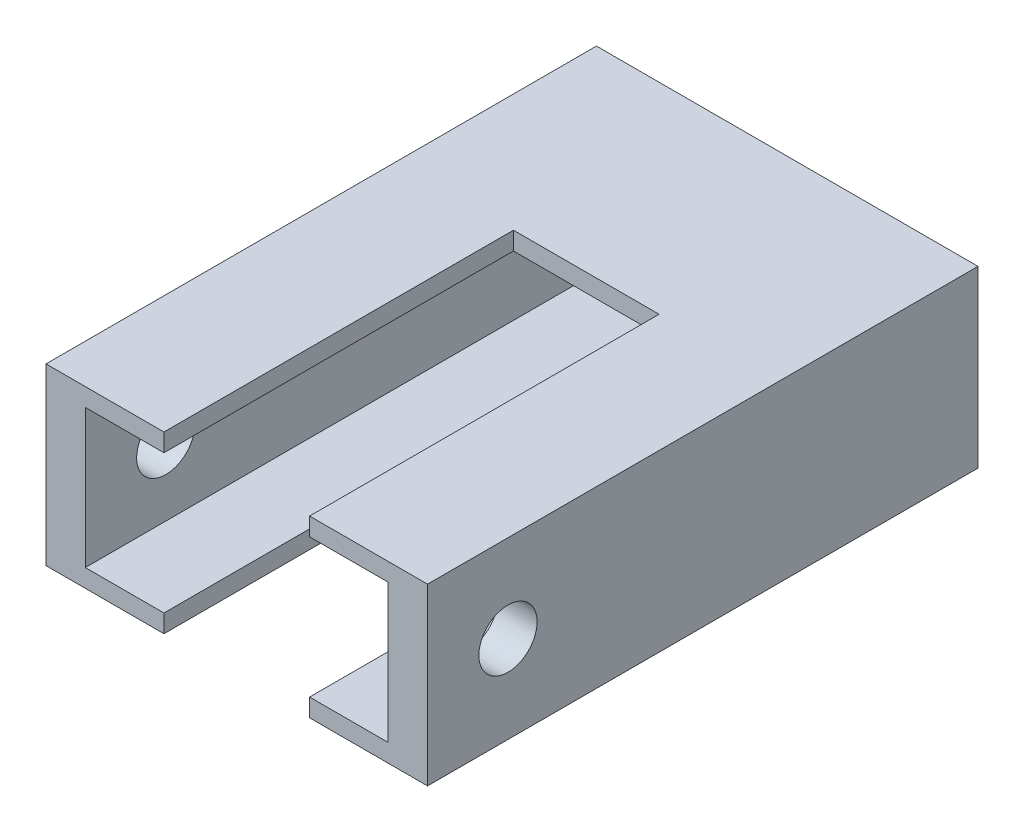
ISO-10303-21;
HEADER;
FILE_DESCRIPTION(('STEP AP214'),'2;1');
FILE_NAME('part.step','',(''),(''),'','','');
FILE_SCHEMA(('AUTOMOTIVE_DESIGN { 1 0 10303 214 1 1 1 1 }'));
ENDSEC;
DATA;
#1=APPLICATION_CONTEXT('core data for automotive mechanical design processes');
#2=APPLICATION_PROTOCOL_DEFINITION('international standard','automotive_design',2000,#1);
#3=PRODUCT_CONTEXT('',#1,'mechanical');
#4=PRODUCT('Part','Part','',(#3));
#5=PRODUCT_RELATED_PRODUCT_CATEGORY('part','',(#4));
#6=PRODUCT_DEFINITION_FORMATION('','',#4);
#7=PRODUCT_DEFINITION_CONTEXT('part definition',#1,'design');
#8=PRODUCT_DEFINITION('design','',#6,#7);
#9=PRODUCT_DEFINITION_SHAPE('','',#8);
#10=(LENGTH_UNIT() NAMED_UNIT(*) SI_UNIT(.MILLI.,.METRE.));
#11=(NAMED_UNIT(*) PLANE_ANGLE_UNIT() SI_UNIT($,.RADIAN.));
#12=(NAMED_UNIT(*) SI_UNIT($,.STERADIAN.) SOLID_ANGLE_UNIT());
#13=UNCERTAINTY_MEASURE_WITH_UNIT(LENGTH_MEASURE(1.E-05),#10,'distance_accuracy_value','');
#14=(GEOMETRIC_REPRESENTATION_CONTEXT(3) GLOBAL_UNCERTAINTY_ASSIGNED_CONTEXT((#13)) GLOBAL_UNIT_ASSIGNED_CONTEXT((#10,
#11,#12)) REPRESENTATION_CONTEXT('',''));
#15=CARTESIAN_POINT('',(0.,0.,0.));
#16=DIRECTION('',(0.,0.,1.));
#17=DIRECTION('',(1.,0.,0.));
#18=AXIS2_PLACEMENT_3D('',#15,#16,#17);
#19=CARTESIAN_POINT('',(0.,0.,94.5));
#20=DIRECTION('',(0.,0.,-1.));
#21=DIRECTION('',(-1.,0.,0.));
#22=AXIS2_PLACEMENT_3D('',#19,#20,#21);
#23=PLANE('',#22);
#24=DIRECTION('',(1.,0.,0.));
#25=VECTOR('',#24,1.);
#26=CARTESIAN_POINT('',(-32.75,15.,94.5));
#27=LINE('',#26,#25);
#28=CARTESIAN_POINT('',(12.5,15.,94.5));
#29=VERTEX_POINT('',#28);
#30=CARTESIAN_POINT('',(32.75,15.,94.5));
#31=VERTEX_POINT('',#30);
#32=EDGE_CURVE('E297',#29,#31,#27,.T.);
#33=ORIENTED_EDGE('',*,*,#32,.F.);
#34=DIRECTION('',(0.,1.,0.));
#35=VECTOR('',#34,1.);
#36=CARTESIAN_POINT('',(12.5,15.,94.5));
#37=LINE('',#36,#35);
#38=CARTESIAN_POINT('',(12.5,11.9083969465649,94.5));
#39=VERTEX_POINT('',#38);
#40=EDGE_CURVE('E371',#39,#29,#37,.T.);
#41=ORIENTED_EDGE('',*,*,#40,.F.);
#42=DIRECTION('',(1.,0.,0.));
#43=VECTOR('',#42,1.);
#44=CARTESIAN_POINT('',(-26.,11.9083969465649,94.5));
#45=LINE('',#44,#43);
#46=CARTESIAN_POINT('',(26.,11.9083969465649,94.5));
#47=VERTEX_POINT('',#46);
#48=EDGE_CURVE('E263',#39,#47,#45,.T.);
#49=ORIENTED_EDGE('',*,*,#48,.T.);
#50=DIRECTION('',(0.,-1.,0.));
#51=VECTOR('',#50,1.);
#52=CARTESIAN_POINT('',(26.,11.9083969465649,94.5));
#53=LINE('',#52,#51);
#54=CARTESIAN_POINT('',(26.,-11.9083969465649,94.5));
#55=VERTEX_POINT('',#54);
#56=EDGE_CURVE('E259',#47,#55,#53,.T.);
#57=ORIENTED_EDGE('',*,*,#56,.T.);
#58=DIRECTION('',(1.,0.,0.));
#59=VECTOR('',#58,1.);
#60=CARTESIAN_POINT('',(-26.,-11.9083969465649,94.5));
#61=LINE('',#60,#59);
#62=CARTESIAN_POINT('',(12.5,-11.9083969465649,94.5));
#63=VERTEX_POINT('',#62);
#64=EDGE_CURVE('E254',#63,#55,#61,.T.);
#65=ORIENTED_EDGE('',*,*,#64,.F.);
#66=CARTESIAN_POINT('',(12.5,-15.,94.5));
#67=VERTEX_POINT('',#66);
#68=EDGE_CURVE('E357',#67,#63,#37,.T.);
#69=ORIENTED_EDGE('',*,*,#68,.F.);
#70=DIRECTION('',(1.,0.,0.));
#71=VECTOR('',#70,1.);
#72=CARTESIAN_POINT('',(-32.75,-15.,94.5));
#73=LINE('',#72,#71);
#74=CARTESIAN_POINT('',(32.75,-15.,94.5));
#75=VERTEX_POINT('',#74);
#76=EDGE_CURVE('E293',#67,#75,#73,.T.);
#77=ORIENTED_EDGE('',*,*,#76,.T.);
#78=DIRECTION('',(0.,-1.,0.));
#79=VECTOR('',#78,1.);
#80=CARTESIAN_POINT('',(32.75,15.,94.5));
#81=LINE('',#80,#79);
#82=EDGE_CURVE('E292',#31,#75,#81,.T.);
#83=ORIENTED_EDGE('',*,*,#82,.F.);
#84=EDGE_LOOP('',(#33,#41,#49,#57,#65,#69,#77,#83));
#85=FACE_BOUND('',#84,.T.);
#86=ADVANCED_FACE('F69',(#85),#23,.F.);
#87=CARTESIAN_POINT('',(-26.,-11.9083969465649,94.5));
#88=DIRECTION('',(0.,1.,0.));
#89=DIRECTION('',(0.,0.,1.));
#90=AXIS2_PLACEMENT_3D('',#87,#88,#89);
#91=PLANE('',#90);
#92=DIRECTION('',(0.,0.,-1.));
#93=VECTOR('',#92,1.);
#94=CARTESIAN_POINT('',(12.5,-11.9083969465649,94.5));
#95=LINE('',#94,#93);
#96=CARTESIAN_POINT('',(12.5,-11.9083969465649,34.5));
#97=VERTEX_POINT('',#96);
#98=EDGE_CURVE('E235',#63,#97,#95,.T.);
#99=ORIENTED_EDGE('',*,*,#98,.F.);
#100=ORIENTED_EDGE('',*,*,#64,.T.);
#101=DIRECTION('',(0.,0.,-1.));
#102=VECTOR('',#101,1.);
#103=CARTESIAN_POINT('',(26.,-11.9083969465649,94.5));
#104=LINE('',#103,#102);
#105=CARTESIAN_POINT('',(26.,-11.9083969465649,10.));
#106=VERTEX_POINT('',#105);
#107=EDGE_CURVE('E283',#55,#106,#104,.T.);
#108=ORIENTED_EDGE('',*,*,#107,.T.);
#109=DIRECTION('',(-1.,0.,0.));
#110=VECTOR('',#109,1.);
#111=CARTESIAN_POINT('',(26.,-11.9083969465649,10.));
#112=LINE('',#111,#110);
#113=CARTESIAN_POINT('',(-26.,-11.9083969465649,10.));
#114=VERTEX_POINT('',#113);
#115=EDGE_CURVE('E250',#106,#114,#112,.T.);
#116=ORIENTED_EDGE('',*,*,#115,.T.);
#117=DIRECTION('',(0.,0.,-1.));
#118=VECTOR('',#117,1.);
#119=CARTESIAN_POINT('',(-26.,-11.9083969465649,94.5));
#120=LINE('',#119,#118);
#121=CARTESIAN_POINT('',(-26.,-11.9083969465649,94.5));
#122=VERTEX_POINT('',#121);
#123=EDGE_CURVE('E271',#122,#114,#120,.T.);
#124=ORIENTED_EDGE('',*,*,#123,.F.);
#125=CARTESIAN_POINT('',(-12.5,-11.9083969465649,94.5));
#126=VERTEX_POINT('',#125);
#127=EDGE_CURVE('E255',#122,#126,#61,.T.);
#128=ORIENTED_EDGE('',*,*,#127,.T.);
#129=DIRECTION('',(0.,0.,1.));
#130=VECTOR('',#129,1.);
#131=CARTESIAN_POINT('',(-12.5,-11.9083969465649,94.5));
#132=LINE('',#131,#130);
#133=CARTESIAN_POINT('',(-12.5,-11.9083969465649,34.5));
#134=VERTEX_POINT('',#133);
#135=EDGE_CURVE('E228',#134,#126,#132,.T.);
#136=ORIENTED_EDGE('',*,*,#135,.F.);
#137=DIRECTION('',(1.,0.,0.));
#138=VECTOR('',#137,1.);
#139=CARTESIAN_POINT('',(-26.,-11.9083969465649,34.5));
#140=LINE('',#139,#138);
#141=EDGE_CURVE('E222',#134,#97,#140,.T.);
#142=ORIENTED_EDGE('',*,*,#141,.T.);
#143=EDGE_LOOP('',(#99,#100,#108,#116,#124,#128,#136,#142));
#144=FACE_BOUND('',#143,.T.);
#145=ADVANCED_FACE('F377',(#144),#91,.T.);
#146=CARTESIAN_POINT('',(26.,11.9083969465649,94.5));
#147=DIRECTION('',(1.,0.,0.));
#148=DIRECTION('',(0.,0.,-1.));
#149=AXIS2_PLACEMENT_3D('',#146,#147,#148);
#150=PLANE('',#149);
#151=CARTESIAN_POINT('',(26.,0.,80.6908236263912));
#152=DIRECTION('',(1.,0.,0.));
#153=DIRECTION('',(0.,0.,-1.));
#154=AXIS2_PLACEMENT_3D('',#151,#152,#153);
#155=CIRCLE('',#154,5.);
#156=CARTESIAN_POINT('',(26.,0.,75.6908236263912));
#157=VERTEX_POINT('',#156);
#158=EDGE_CURVE('E400',#157,#157,#155,.T.);
#159=ORIENTED_EDGE('',*,*,#158,.T.);
#160=EDGE_LOOP('',(#159));
#161=FACE_BOUND('',#160,.T.);
#162=DIRECTION('',(0.,-1.,0.));
#163=VECTOR('',#162,1.);
#164=CARTESIAN_POINT('',(26.,11.9083969465649,10.));
#165=LINE('',#164,#163);
#166=CARTESIAN_POINT('',(26.,11.9083969465649,10.));
#167=VERTEX_POINT('',#166);
#168=EDGE_CURVE('E246',#167,#106,#165,.T.);
#169=ORIENTED_EDGE('',*,*,#168,.T.);
#170=ORIENTED_EDGE('',*,*,#107,.F.);
#171=ORIENTED_EDGE('',*,*,#56,.F.);
#172=DIRECTION('',(0.,0.,-1.));
#173=VECTOR('',#172,1.);
#174=CARTESIAN_POINT('',(26.,11.9083969465649,94.5));
#175=LINE('',#174,#173);
#176=EDGE_CURVE('E279',#47,#167,#175,.T.);
#177=ORIENTED_EDGE('',*,*,#176,.T.);
#178=EDGE_LOOP('',(#169,#170,#171,#177));
#179=FACE_BOUND('',#178,.T.);
#180=ADVANCED_FACE('F380',(#161,#179),#150,.F.);
#181=CARTESIAN_POINT('',(-26.,11.9083969465649,94.5));
#182=DIRECTION('',(0.,1.,0.));
#183=DIRECTION('',(0.,0.,1.));
#184=AXIS2_PLACEMENT_3D('',#181,#182,#183);
#185=PLANE('',#184);
#186=ORIENTED_EDGE('',*,*,#48,.F.);
#187=DIRECTION('',(0.,0.,-1.));
#188=VECTOR('',#187,1.);
#189=CARTESIAN_POINT('',(12.5,11.9083969465649,94.5));
#190=LINE('',#189,#188);
#191=CARTESIAN_POINT('',(12.5,11.9083969465649,34.5));
#192=VERTEX_POINT('',#191);
#193=EDGE_CURVE('E231',#39,#192,#190,.T.);
#194=ORIENTED_EDGE('',*,*,#193,.T.);
#195=DIRECTION('',(1.,0.,0.));
#196=VECTOR('',#195,1.);
#197=CARTESIAN_POINT('',(-26.,11.9083969465649,34.5));
#198=LINE('',#197,#196);
#199=CARTESIAN_POINT('',(-12.5,11.9083969465649,34.5));
#200=VERTEX_POINT('',#199);
#201=EDGE_CURVE('E219',#200,#192,#198,.T.);
#202=ORIENTED_EDGE('',*,*,#201,.F.);
#203=DIRECTION('',(0.,0.,1.));
#204=VECTOR('',#203,1.);
#205=CARTESIAN_POINT('',(-12.5,11.9083969465649,94.5));
#206=LINE('',#205,#204);
#207=CARTESIAN_POINT('',(-12.5,11.9083969465649,94.5));
#208=VERTEX_POINT('',#207);
#209=EDGE_CURVE('E191',#200,#208,#206,.T.);
#210=ORIENTED_EDGE('',*,*,#209,.T.);
#211=CARTESIAN_POINT('',(-26.,11.9083969465649,94.5));
#212=VERTEX_POINT('',#211);
#213=EDGE_CURVE('E264',#212,#208,#45,.T.);
#214=ORIENTED_EDGE('',*,*,#213,.F.);
#215=DIRECTION('',(0.,0.,-1.));
#216=VECTOR('',#215,1.);
#217=CARTESIAN_POINT('',(-26.,11.9083969465649,94.5));
#218=LINE('',#217,#216);
#219=CARTESIAN_POINT('',(-26.,11.9083969465649,9.99999999999999));
#220=VERTEX_POINT('',#219);
#221=EDGE_CURVE('E275',#212,#220,#218,.T.);
#222=ORIENTED_EDGE('',*,*,#221,.T.);
#223=DIRECTION('',(1.,0.,0.));
#224=VECTOR('',#223,1.);
#225=CARTESIAN_POINT('',(26.,11.9083969465649,10.));
#226=LINE('',#225,#224);
#227=EDGE_CURVE('E242',#220,#167,#226,.T.);
#228=ORIENTED_EDGE('',*,*,#227,.T.);
#229=ORIENTED_EDGE('',*,*,#176,.F.);
#230=EDGE_LOOP('',(#186,#194,#202,#210,#214,#222,#228,#229));
#231=FACE_BOUND('',#230,.T.);
#232=ADVANCED_FACE('F385',(#231),#185,.F.);
#233=CARTESIAN_POINT('',(-26.,11.9083969465649,94.5));
#234=DIRECTION('',(1.,0.,0.));
#235=DIRECTION('',(0.,0.,-1.));
#236=AXIS2_PLACEMENT_3D('',#233,#234,#235);
#237=PLANE('',#236);
#238=CARTESIAN_POINT('',(-26.,0.,80.6908236263912));
#239=DIRECTION('',(1.,0.,0.));
#240=DIRECTION('',(0.,0.,-1.));
#241=AXIS2_PLACEMENT_3D('',#238,#239,#240);
#242=CIRCLE('',#241,5.);
#243=CARTESIAN_POINT('',(-26.,0.,75.6908236263912));
#244=VERTEX_POINT('',#243);
#245=EDGE_CURVE('E404',#244,#244,#242,.T.);
#246=ORIENTED_EDGE('',*,*,#245,.F.);
#247=EDGE_LOOP('',(#246));
#248=FACE_BOUND('',#247,.T.);
#249=ORIENTED_EDGE('',*,*,#123,.T.);
#250=DIRECTION('',(0.,1.,0.));
#251=VECTOR('',#250,1.);
#252=CARTESIAN_POINT('',(-26.,11.9083969465649,10.));
#253=LINE('',#252,#251);
#254=EDGE_CURVE('E238',#114,#220,#253,.T.);
#255=ORIENTED_EDGE('',*,*,#254,.T.);
#256=ORIENTED_EDGE('',*,*,#221,.F.);
#257=DIRECTION('',(0.,-1.,0.));
#258=VECTOR('',#257,1.);
#259=CARTESIAN_POINT('',(-26.,11.9083969465649,94.5));
#260=LINE('',#259,#258);
#261=EDGE_CURVE('E268',#212,#122,#260,.T.);
#262=ORIENTED_EDGE('',*,*,#261,.T.);
#263=EDGE_LOOP('',(#249,#255,#256,#262));
#264=FACE_BOUND('',#263,.T.);
#265=ADVANCED_FACE('F390',(#248,#264),#237,.T.);
#266=CARTESIAN_POINT('',(-32.75,-15.,94.5));
#267=VERTEX_POINT('',#266);
#268=CARTESIAN_POINT('',(-12.5,-15.,94.5));
#269=VERTEX_POINT('',#268);
#270=EDGE_CURVE('E288',#267,#269,#73,.T.);
#271=ORIENTED_EDGE('',*,*,#270,.T.);
#272=DIRECTION('',(0.,-1.,0.));
#273=VECTOR('',#272,1.);
#274=CARTESIAN_POINT('',(-12.5,15.,94.5));
#275=LINE('',#274,#273);
#276=EDGE_CURVE('E349',#126,#269,#275,.T.);
#277=ORIENTED_EDGE('',*,*,#276,.F.);
#278=ORIENTED_EDGE('',*,*,#127,.F.);
#279=ORIENTED_EDGE('',*,*,#261,.F.);
#280=ORIENTED_EDGE('',*,*,#213,.T.);
#281=CARTESIAN_POINT('',(-12.5,15.,94.5));
#282=VERTEX_POINT('',#281);
#283=EDGE_CURVE('E350',#282,#208,#275,.T.);
#284=ORIENTED_EDGE('',*,*,#283,.F.);
#285=CARTESIAN_POINT('',(-32.75,15.,94.5));
#286=VERTEX_POINT('',#285);
#287=EDGE_CURVE('E209',#286,#282,#27,.T.);
#288=ORIENTED_EDGE('',*,*,#287,.F.);
#289=DIRECTION('',(0.,-1.,0.));
#290=VECTOR('',#289,1.);
#291=CARTESIAN_POINT('',(-32.75,15.,94.5));
#292=LINE('',#291,#290);
#293=EDGE_CURVE('E300',#286,#267,#292,.T.);
#294=ORIENTED_EDGE('',*,*,#293,.T.);
#295=EDGE_LOOP('',(#271,#277,#278,#279,#280,#284,#288,#294));
#296=FACE_BOUND('',#295,.T.);
#297=ADVANCED_FACE('F347',(#296),#23,.F.);
#298=CARTESIAN_POINT('',(0.,0.,0.));
#299=DIRECTION('',(0.,0.,-1.));
#300=DIRECTION('',(-1.,0.,0.));
#301=AXIS2_PLACEMENT_3D('',#298,#299,#300);
#302=PLANE('',#301);
#303=CARTESIAN_POINT('',(0.,0.,0.));
#304=DIRECTION('',(0.,0.,-1.));
#305=DIRECTION('',(-1.,0.,0.));
#306=AXIS2_PLACEMENT_3D('',#303,#304,#305);
#307=CIRCLE('',#306,5.);
#308=CARTESIAN_POINT('',(-5.,0.,0.));
#309=VERTEX_POINT('',#308);
#310=EDGE_CURVE('E416',#309,#309,#307,.T.);
#311=ORIENTED_EDGE('',*,*,#310,.F.);
#312=EDGE_LOOP('',(#311));
#313=FACE_BOUND('',#312,.T.);
#314=DIRECTION('',(1.,0.,0.));
#315=VECTOR('',#314,1.);
#316=CARTESIAN_POINT('',(-32.75,-15.,0.));
#317=LINE('',#316,#315);
#318=CARTESIAN_POINT('',(-32.75,-15.,0.));
#319=VERTEX_POINT('',#318);
#320=CARTESIAN_POINT('',(32.75,-15.,0.));
#321=VERTEX_POINT('',#320);
#322=EDGE_CURVE('E287',#319,#321,#317,.T.);
#323=ORIENTED_EDGE('',*,*,#322,.F.);
#324=DIRECTION('',(0.,-1.,0.));
#325=VECTOR('',#324,1.);
#326=CARTESIAN_POINT('',(-32.75,15.,0.));
#327=LINE('',#326,#325);
#328=CARTESIAN_POINT('',(-32.75,15.,0.));
#329=VERTEX_POINT('',#328);
#330=EDGE_CURVE('E315',#329,#319,#327,.T.);
#331=ORIENTED_EDGE('',*,*,#330,.F.);
#332=DIRECTION('',(1.,0.,0.));
#333=VECTOR('',#332,1.);
#334=CARTESIAN_POINT('',(-32.75,15.,0.));
#335=LINE('',#334,#333);
#336=CARTESIAN_POINT('',(32.75,15.,0.));
#337=VERTEX_POINT('',#336);
#338=EDGE_CURVE('E311',#329,#337,#335,.T.);
#339=ORIENTED_EDGE('',*,*,#338,.T.);
#340=DIRECTION('',(0.,-1.,0.));
#341=VECTOR('',#340,1.);
#342=CARTESIAN_POINT('',(32.75,15.,0.));
#343=LINE('',#342,#341);
#344=EDGE_CURVE('E307',#337,#321,#343,.T.);
#345=ORIENTED_EDGE('',*,*,#344,.T.);
#346=EDGE_LOOP('',(#323,#331,#339,#345));
#347=FACE_BOUND('',#346,.T.);
#348=ADVANCED_FACE('F336',(#313,#347),#302,.T.);
#349=CARTESIAN_POINT('',(-32.75,-15.,94.5));
#350=DIRECTION('',(0.,1.,0.));
#351=DIRECTION('',(0.,0.,1.));
#352=AXIS2_PLACEMENT_3D('',#349,#350,#351);
#353=PLANE('',#352);
#354=ORIENTED_EDGE('',*,*,#76,.F.);
#355=DIRECTION('',(0.,0.,1.));
#356=VECTOR('',#355,1.);
#357=CARTESIAN_POINT('',(12.5,-15.,34.5));
#358=LINE('',#357,#356);
#359=CARTESIAN_POINT('',(12.5,-15.,34.5));
#360=VERTEX_POINT('',#359);
#361=EDGE_CURVE('E214',#360,#67,#358,.T.);
#362=ORIENTED_EDGE('',*,*,#361,.F.);
#363=DIRECTION('',(1.,0.,0.));
#364=VECTOR('',#363,1.);
#365=CARTESIAN_POINT('',(-12.5,-15.,34.5));
#366=LINE('',#365,#364);
#367=CARTESIAN_POINT('',(-12.5,-15.,34.5));
#368=VERTEX_POINT('',#367);
#369=EDGE_CURVE('E195',#368,#360,#366,.T.);
#370=ORIENTED_EDGE('',*,*,#369,.F.);
#371=DIRECTION('',(0.,0.,1.));
#372=VECTOR('',#371,1.);
#373=CARTESIAN_POINT('',(-12.5,-15.,34.5));
#374=LINE('',#373,#372);
#375=EDGE_CURVE('E86',#368,#269,#374,.T.);
#376=ORIENTED_EDGE('',*,*,#375,.T.);
#377=ORIENTED_EDGE('',*,*,#270,.F.);
#378=DIRECTION('',(0.,0.,-1.));
#379=VECTOR('',#378,1.);
#380=CARTESIAN_POINT('',(-32.75,-15.,94.5));
#381=LINE('',#380,#379);
#382=EDGE_CURVE('E303',#267,#319,#381,.T.);
#383=ORIENTED_EDGE('',*,*,#382,.T.);
#384=ORIENTED_EDGE('',*,*,#322,.T.);
#385=DIRECTION('',(0.,0.,-1.));
#386=VECTOR('',#385,1.);
#387=CARTESIAN_POINT('',(32.75,-15.,94.5));
#388=LINE('',#387,#386);
#389=EDGE_CURVE('E12',#75,#321,#388,.T.);
#390=ORIENTED_EDGE('',*,*,#389,.F.);
#391=EDGE_LOOP('',(#354,#362,#370,#376,#377,#383,#384,#390));
#392=FACE_BOUND('',#391,.T.);
#393=ADVANCED_FACE('F71',(#392),#353,.F.);
#394=CARTESIAN_POINT('',(32.75,15.,94.5));
#395=DIRECTION('',(1.,0.,0.));
#396=DIRECTION('',(0.,1.,0.));
#397=AXIS2_PLACEMENT_3D('',#394,#395,#396);
#398=PLANE('',#397);
#399=CARTESIAN_POINT('',(32.75,0.,80.6908236263912));
#400=DIRECTION('',(-1.,0.,0.));
#401=DIRECTION('',(0.,-1.,0.));
#402=AXIS2_PLACEMENT_3D('',#399,#400,#401);
#403=CIRCLE('',#402,5.);
#404=CARTESIAN_POINT('',(32.75,-4.99999999999999,80.6908236263912));
#405=VERTEX_POINT('',#404);
#406=EDGE_CURVE('E408',#405,#405,#403,.T.);
#407=ORIENTED_EDGE('',*,*,#406,.T.);
#408=EDGE_LOOP('',(#407));
#409=FACE_BOUND('',#408,.T.);
#410=ORIENTED_EDGE('',*,*,#344,.F.);
#411=DIRECTION('',(0.,0.,-1.));
#412=VECTOR('',#411,1.);
#413=CARTESIAN_POINT('',(32.75,15.,94.5));
#414=LINE('',#413,#412);
#415=EDGE_CURVE('E79',#31,#337,#414,.T.);
#416=ORIENTED_EDGE('',*,*,#415,.F.);
#417=ORIENTED_EDGE('',*,*,#82,.T.);
#418=ORIENTED_EDGE('',*,*,#389,.T.);
#419=EDGE_LOOP('',(#410,#416,#417,#418));
#420=FACE_BOUND('',#419,.T.);
#421=ADVANCED_FACE('F331',(#409,#420),#398,.T.);
#422=CARTESIAN_POINT('',(-32.75,15.,94.5));
#423=DIRECTION('',(0.,1.,0.));
#424=DIRECTION('',(0.,0.,1.));
#425=AXIS2_PLACEMENT_3D('',#422,#423,#424);
#426=PLANE('',#425);
#427=DIRECTION('',(0.,0.,1.));
#428=VECTOR('',#427,1.);
#429=CARTESIAN_POINT('',(12.5,15.,34.5));
#430=LINE('',#429,#428);
#431=CARTESIAN_POINT('',(12.5,15.,34.5));
#432=VERTEX_POINT('',#431);
#433=EDGE_CURVE('E94',#432,#29,#430,.T.);
#434=ORIENTED_EDGE('',*,*,#433,.T.);
#435=ORIENTED_EDGE('',*,*,#32,.T.);
#436=ORIENTED_EDGE('',*,*,#415,.T.);
#437=ORIENTED_EDGE('',*,*,#338,.F.);
#438=DIRECTION('',(0.,0.,-1.));
#439=VECTOR('',#438,1.);
#440=CARTESIAN_POINT('',(-32.75,15.,94.5));
#441=LINE('',#440,#439);
#442=EDGE_CURVE('E321',#286,#329,#441,.T.);
#443=ORIENTED_EDGE('',*,*,#442,.F.);
#444=ORIENTED_EDGE('',*,*,#287,.T.);
#445=DIRECTION('',(0.,0.,1.));
#446=VECTOR('',#445,1.);
#447=CARTESIAN_POINT('',(-12.5,15.,34.5));
#448=LINE('',#447,#446);
#449=CARTESIAN_POINT('',(-12.5,15.,34.5));
#450=VERTEX_POINT('',#449);
#451=EDGE_CURVE('E188',#450,#282,#448,.T.);
#452=ORIENTED_EDGE('',*,*,#451,.F.);
#453=DIRECTION('',(-1.,0.,0.));
#454=VECTOR('',#453,1.);
#455=CARTESIAN_POINT('',(-12.5,15.,34.5));
#456=LINE('',#455,#454);
#457=EDGE_CURVE('E199',#432,#450,#456,.T.);
#458=ORIENTED_EDGE('',*,*,#457,.F.);
#459=EDGE_LOOP('',(#434,#435,#436,#437,#443,#444,#452,#458));
#460=FACE_BOUND('',#459,.T.);
#461=ADVANCED_FACE('F207',(#460),#426,.T.);
#462=CARTESIAN_POINT('',(-32.75,15.,94.5));
#463=DIRECTION('',(1.,0.,0.));
#464=DIRECTION('',(0.,1.,0.));
#465=AXIS2_PLACEMENT_3D('',#462,#463,#464);
#466=PLANE('',#465);
#467=CARTESIAN_POINT('',(-32.75,0.,80.6908236263912));
#468=DIRECTION('',(-1.,0.,0.));
#469=DIRECTION('',(0.,-1.,0.));
#470=AXIS2_PLACEMENT_3D('',#467,#468,#469);
#471=CIRCLE('',#470,5.);
#472=CARTESIAN_POINT('',(-32.75,-5.00000000000002,80.6908236263912));
#473=VERTEX_POINT('',#472);
#474=EDGE_CURVE('E409',#473,#473,#471,.T.);
#475=ORIENTED_EDGE('',*,*,#474,.F.);
#476=EDGE_LOOP('',(#475));
#477=FACE_BOUND('',#476,.T.);
#478=ORIENTED_EDGE('',*,*,#330,.T.);
#479=ORIENTED_EDGE('',*,*,#382,.F.);
#480=ORIENTED_EDGE('',*,*,#293,.F.);
#481=ORIENTED_EDGE('',*,*,#442,.T.);
#482=EDGE_LOOP('',(#478,#479,#480,#481));
#483=FACE_BOUND('',#482,.T.);
#484=ADVANCED_FACE('F339',(#477,#483),#466,.F.);
#485=CARTESIAN_POINT('',(0.,0.,10.));
#486=DIRECTION('',(0.,0.,-1.));
#487=DIRECTION('',(-1.,0.,0.));
#488=AXIS2_PLACEMENT_3D('',#485,#486,#487);
#489=PLANE('',#488);
#490=CARTESIAN_POINT('',(0.,0.,9.99999999999999));
#491=DIRECTION('',(0.,0.,-1.));
#492=DIRECTION('',(-1.,0.,0.));
#493=AXIS2_PLACEMENT_3D('',#490,#491,#492);
#494=CIRCLE('',#493,5.);
#495=CARTESIAN_POINT('',(-5.,0.,9.99999999999999));
#496=VERTEX_POINT('',#495);
#497=EDGE_CURVE('E73',#496,#496,#494,.T.);
#498=ORIENTED_EDGE('',*,*,#497,.T.);
#499=EDGE_LOOP('',(#498));
#500=FACE_BOUND('',#499,.T.);
#501=ORIENTED_EDGE('',*,*,#254,.F.);
#502=ORIENTED_EDGE('',*,*,#115,.F.);
#503=ORIENTED_EDGE('',*,*,#168,.F.);
#504=ORIENTED_EDGE('',*,*,#227,.F.);
#505=EDGE_LOOP('',(#501,#502,#503,#504));
#506=FACE_BOUND('',#505,.T.);
#507=ADVANCED_FACE('F388',(#500,#506),#489,.F.);
#508=CARTESIAN_POINT('',(0.,0.,34.5));
#509=DIRECTION('',(0.,0.,1.));
#510=DIRECTION('',(1.,0.,0.));
#511=AXIS2_PLACEMENT_3D('',#508,#509,#510);
#512=PLANE('',#511);
#513=ORIENTED_EDGE('',*,*,#201,.T.);
#514=DIRECTION('',(0.,1.,0.));
#515=VECTOR('',#514,1.);
#516=CARTESIAN_POINT('',(12.5,15.,34.5));
#517=LINE('',#516,#515);
#518=EDGE_CURVE('E201',#192,#432,#517,.T.);
#519=ORIENTED_EDGE('',*,*,#518,.T.);
#520=ORIENTED_EDGE('',*,*,#457,.T.);
#521=DIRECTION('',(0.,-1.,0.));
#522=VECTOR('',#521,1.);
#523=CARTESIAN_POINT('',(-12.5,15.,34.5));
#524=LINE('',#523,#522);
#525=EDGE_CURVE('E184',#450,#200,#524,.T.);
#526=ORIENTED_EDGE('',*,*,#525,.T.);
#527=EDGE_LOOP('',(#513,#519,#520,#526));
#528=FACE_BOUND('',#527,.T.);
#529=ADVANCED_FACE('F200',(#528),#512,.T.);
#530=CARTESIAN_POINT('',(-12.5,15.,34.5));
#531=DIRECTION('',(-1.,0.,0.));
#532=DIRECTION('',(0.,0.,1.));
#533=AXIS2_PLACEMENT_3D('',#530,#531,#532);
#534=PLANE('',#533);
#535=ORIENTED_EDGE('',*,*,#525,.F.);
#536=ORIENTED_EDGE('',*,*,#451,.T.);
#537=ORIENTED_EDGE('',*,*,#283,.T.);
#538=ORIENTED_EDGE('',*,*,#209,.F.);
#539=EDGE_LOOP('',(#535,#536,#537,#538));
#540=FACE_BOUND('',#539,.T.);
#541=ADVANCED_FACE('F186',(#540),#534,.F.);
#542=CARTESIAN_POINT('',(12.5,15.,34.5));
#543=DIRECTION('',(1.,0.,0.));
#544=DIRECTION('',(0.,1.,0.));
#545=AXIS2_PLACEMENT_3D('',#542,#543,#544);
#546=PLANE('',#545);
#547=ORIENTED_EDGE('',*,*,#40,.T.);
#548=ORIENTED_EDGE('',*,*,#433,.F.);
#549=ORIENTED_EDGE('',*,*,#518,.F.);
#550=ORIENTED_EDGE('',*,*,#193,.F.);
#551=EDGE_LOOP('',(#547,#548,#549,#550));
#552=FACE_BOUND('',#551,.T.);
#553=ADVANCED_FACE('F491',(#552),#546,.F.);
#554=ORIENTED_EDGE('',*,*,#98,.T.);
#555=EDGE_CURVE('E204',#360,#97,#517,.T.);
#556=ORIENTED_EDGE('',*,*,#555,.F.);
#557=ORIENTED_EDGE('',*,*,#361,.T.);
#558=ORIENTED_EDGE('',*,*,#68,.T.);
#559=EDGE_LOOP('',(#554,#556,#557,#558));
#560=FACE_BOUND('',#559,.T.);
#561=ADVANCED_FACE('F364',(#560),#546,.F.);
#562=ORIENTED_EDGE('',*,*,#135,.T.);
#563=ORIENTED_EDGE('',*,*,#276,.T.);
#564=ORIENTED_EDGE('',*,*,#375,.F.);
#565=EDGE_CURVE('E196',#134,#368,#524,.T.);
#566=ORIENTED_EDGE('',*,*,#565,.F.);
#567=EDGE_LOOP('',(#562,#563,#564,#566));
#568=FACE_BOUND('',#567,.T.);
#569=ADVANCED_FACE('F393',(#568),#534,.F.);
#570=ORIENTED_EDGE('',*,*,#565,.T.);
#571=ORIENTED_EDGE('',*,*,#369,.T.);
#572=ORIENTED_EDGE('',*,*,#555,.T.);
#573=ORIENTED_EDGE('',*,*,#141,.F.);
#574=EDGE_LOOP('',(#570,#571,#572,#573));
#575=FACE_BOUND('',#574,.T.);
#576=ADVANCED_FACE('F397',(#575),#512,.T.);
#577=CARTESIAN_POINT('',(32.75,0.,80.6908236263912));
#578=DIRECTION('',(-1.,0.,0.));
#579=DIRECTION('',(0.,-1.,0.));
#580=AXIS2_PLACEMENT_3D('',#577,#578,#579);
#581=CYLINDRICAL_SURFACE('',#580,5.);
#582=ORIENTED_EDGE('',*,*,#245,.T.);
#583=EDGE_LOOP('',(#582));
#584=FACE_BOUND('',#583,.T.);
#585=ORIENTED_EDGE('',*,*,#474,.T.);
#586=EDGE_LOOP('',(#585));
#587=FACE_BOUND('',#586,.T.);
#588=ADVANCED_FACE('F434',(#584,#587),#581,.F.);
#589=ORIENTED_EDGE('',*,*,#406,.F.);
#590=EDGE_LOOP('',(#589));
#591=FACE_BOUND('',#590,.T.);
#592=ORIENTED_EDGE('',*,*,#158,.F.);
#593=EDGE_LOOP('',(#592));
#594=FACE_BOUND('',#593,.T.);
#595=ADVANCED_FACE('F428',(#591,#594),#581,.F.);
#596=CARTESIAN_POINT('',(0.,0.,94.5));
#597=DIRECTION('',(0.,0.,-1.));
#598=DIRECTION('',(-1.,0.,0.));
#599=AXIS2_PLACEMENT_3D('',#596,#597,#598);
#600=CYLINDRICAL_SURFACE('',#599,5.);
#601=ORIENTED_EDGE('',*,*,#310,.T.);
#602=EDGE_LOOP('',(#601));
#603=FACE_BOUND('',#602,.T.);
#604=ORIENTED_EDGE('',*,*,#497,.F.);
#605=EDGE_LOOP('',(#604));
#606=FACE_BOUND('',#605,.T.);
#607=ADVANCED_FACE('F426',(#603,#606),#600,.F.);
#608=CLOSED_SHELL('',(#86,#145,#180,#232,#265,#297,#348,#393,#421,#461,#484,#507,#529,#541,#553,
#561,#569,#576,#588,#595,#607));
#609=MANIFOLD_SOLID_BREP('B2',#608);
#610=ADVANCED_BREP_SHAPE_REPRESENTATION('',(#18,#609),#14);
#611=SHAPE_DEFINITION_REPRESENTATION(#9,#610);
ENDSEC;
END-ISO-10303-21;
